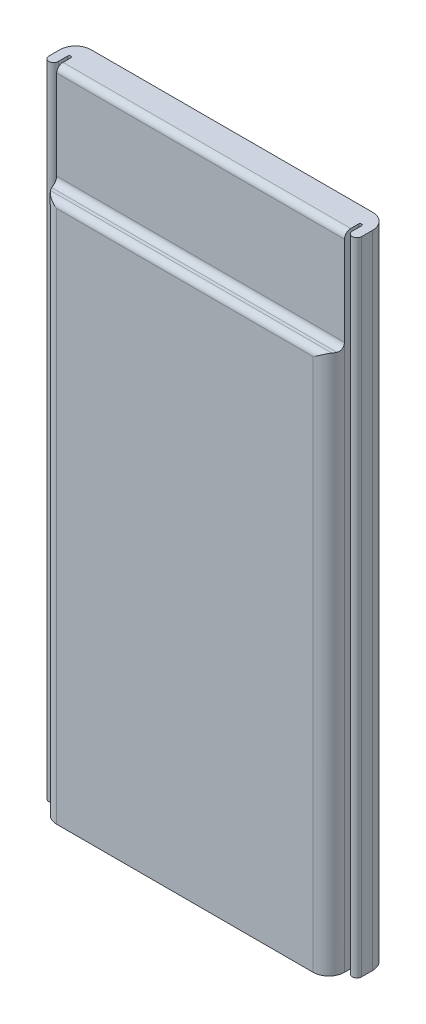
ISO-10303-21;
HEADER;
FILE_DESCRIPTION(('STEP AP214'),'2;1');
FILE_NAME('part.step','',(''),(''),'','','');
FILE_SCHEMA(('AUTOMOTIVE_DESIGN { 1 0 10303 214 1 1 1 1 }'));
ENDSEC;
DATA;
#1=APPLICATION_CONTEXT('core data for automotive mechanical design processes');
#2=APPLICATION_PROTOCOL_DEFINITION('international standard','automotive_design',2000,#1);
#3=PRODUCT_CONTEXT('',#1,'mechanical');
#4=PRODUCT('Part','Part','',(#3));
#5=PRODUCT_RELATED_PRODUCT_CATEGORY('part','',(#4));
#6=PRODUCT_DEFINITION_FORMATION('','',#4);
#7=PRODUCT_DEFINITION_CONTEXT('part definition',#1,'design');
#8=PRODUCT_DEFINITION('design','',#6,#7);
#9=PRODUCT_DEFINITION_SHAPE('','',#8);
#10=(LENGTH_UNIT() NAMED_UNIT(*) SI_UNIT(.MILLI.,.METRE.));
#11=(NAMED_UNIT(*) PLANE_ANGLE_UNIT() SI_UNIT($,.RADIAN.));
#12=(NAMED_UNIT(*) SI_UNIT($,.STERADIAN.) SOLID_ANGLE_UNIT());
#13=UNCERTAINTY_MEASURE_WITH_UNIT(LENGTH_MEASURE(1.E-05),#10,'distance_accuracy_value','');
#14=(GEOMETRIC_REPRESENTATION_CONTEXT(3) GLOBAL_UNCERTAINTY_ASSIGNED_CONTEXT((#13)) GLOBAL_UNIT_ASSIGNED_CONTEXT((#10,
#11,#12)) REPRESENTATION_CONTEXT('',''));
#15=CARTESIAN_POINT('',(0.,0.,0.));
#16=DIRECTION('',(0.,0.,1.));
#17=DIRECTION('',(1.,0.,0.));
#18=AXIS2_PLACEMENT_3D('',#15,#16,#17);
#19=CARTESIAN_POINT('',(-9.2,20.5,2.));
#20=DIRECTION('',(1.,0.,0.));
#21=DIRECTION('',(0.,0.,-1.));
#22=AXIS2_PLACEMENT_3D('',#19,#20,#21);
#23=PLANE('',#22);
#24=CARTESIAN_POINT('',(-9.2,20.1,1.6));
#25=DIRECTION('',(1.,0.,0.));
#26=DIRECTION('',(0.,0.,-1.));
#27=AXIS2_PLACEMENT_3D('',#24,#25,#26);
#28=CIRCLE('',#27,0.400000000000001);
#29=CARTESIAN_POINT('',(-9.2,20.5,1.6));
#30=VERTEX_POINT('',#29);
#31=CARTESIAN_POINT('',(-9.2,20.1,2.));
#32=VERTEX_POINT('',#31);
#33=EDGE_CURVE('E452',#30,#32,#28,.T.);
#34=ORIENTED_EDGE('',*,*,#33,.F.);
#35=DIRECTION('',(0.,0.,1.));
#36=VECTOR('',#35,1.);
#37=CARTESIAN_POINT('',(-9.2,20.5,2.));
#38=LINE('',#37,#36);
#39=CARTESIAN_POINT('',(-9.2,20.5,1.1));
#40=VERTEX_POINT('',#39);
#41=EDGE_CURVE('E268',#40,#30,#38,.T.);
#42=ORIENTED_EDGE('',*,*,#41,.F.);
#43=DIRECTION('',(0.,-1.,0.));
#44=VECTOR('',#43,1.);
#45=CARTESIAN_POINT('',(-9.2,20.5,1.1));
#46=LINE('',#45,#44);
#47=CARTESIAN_POINT('',(-9.2,-20.5,1.1));
#48=VERTEX_POINT('',#47);
#49=EDGE_CURVE('E236',#40,#48,#46,.T.);
#50=ORIENTED_EDGE('',*,*,#49,.T.);
#51=DIRECTION('',(0.,0.,1.));
#52=VECTOR('',#51,1.);
#53=CARTESIAN_POINT('',(-9.2,-20.5,2.));
#54=LINE('',#53,#52);
#55=CARTESIAN_POINT('',(-9.2,-20.5,2.));
#56=VERTEX_POINT('',#55);
#57=EDGE_CURVE('E191',#48,#56,#54,.T.);
#58=ORIENTED_EDGE('',*,*,#57,.T.);
#59=DIRECTION('',(0.,-1.,0.));
#60=VECTOR('',#59,1.);
#61=CARTESIAN_POINT('',(-9.2,20.5,2.));
#62=LINE('',#61,#60);
#63=CARTESIAN_POINT('',(-9.2,14.4,2.));
#64=VERTEX_POINT('',#63);
#65=EDGE_CURVE('E234',#64,#56,#62,.T.);
#66=ORIENTED_EDGE('',*,*,#65,.F.);
#67=DIRECTION('',(0.,-1.,0.));
#68=VECTOR('',#67,1.);
#69=CARTESIAN_POINT('',(-9.2,20.5,2.));
#70=LINE('',#69,#68);
#71=EDGE_CURVE('E435',#32,#64,#70,.T.);
#72=ORIENTED_EDGE('',*,*,#71,.F.);
#73=EDGE_LOOP('',(#34,#42,#50,#58,#66,#72));
#74=FACE_BOUND('',#73,.T.);
#75=ADVANCED_FACE('F35',(#74),#23,.F.);
#76=CARTESIAN_POINT('',(-8.2,20.5,2.));
#77=DIRECTION('',(0.,-1.,0.));
#78=DIRECTION('',(0.,0.,-1.));
#79=AXIS2_PLACEMENT_3D('',#76,#77,#78);
#80=CYLINDRICAL_SURFACE('',#79,1.);
#81=CARTESIAN_POINT('',(-9.2,14.4,2.));
#82=CARTESIAN_POINT('',(-9.19997847905916,14.3775325233535,1.99998093151565));
#83=CARTESIAN_POINT('',(-9.19999963365322,14.355070373881,2.00189182556233));
#84=CARTESIAN_POINT('',(-9.19996829370539,14.3107904412264,2.00943417123763));
#85=CARTESIAN_POINT('',(-9.19991583583453,14.2889723427291,2.01506376960551));
#86=CARTESIAN_POINT('',(-9.19957847014619,14.2465785727421,2.0299086262157));
#87=CARTESIAN_POINT('',(-9.19929343033504,14.2260036138756,2.03912591897356));
#88=CARTESIAN_POINT('',(-9.19820511756865,14.1867020384617,2.0608718750226));
#89=CARTESIAN_POINT('',(-9.19740192790328,14.1679751254084,2.07340000592295));
#90=CARTESIAN_POINT('',(-9.19495392794561,14.1330328543871,2.10129448001161));
#91=CARTESIAN_POINT('',(-9.19331472254887,14.1168016954871,2.11664149165532));
#92=CARTESIAN_POINT('',(-9.18886878410621,14.0871864353159,2.14972019250299));
#93=CARTESIAN_POINT('',(-9.18606257639943,14.073801057077,2.16745080627446));
#94=CARTESIAN_POINT('',(-9.17910873460781,14.0505573373619,2.20416996949274));
#95=CARTESIAN_POINT('',(-9.17499911965366,14.0406139847208,2.22311199240439));
#96=CARTESIAN_POINT('',(-9.16527183490216,14.0239573871511,2.26201544015336));
#97=CARTESIAN_POINT('',(-9.15965346180776,14.0172456527044,2.28197733687485));
#98=CARTESIAN_POINT('',(-9.14810241763259,14.008044007862,2.31842546140316));
#99=CARTESIAN_POINT('',(-9.14242865197299,14.0049967480144,2.33485751705032));
#100=CARTESIAN_POINT('',(-9.13015337511731,14.0009729837141,2.36759286116685));
#101=CARTESIAN_POINT('',(-9.12355371623052,13.9999924059977,2.38389633971359));
#102=CARTESIAN_POINT('',(-9.11651513899117,14.,2.4));
#103=B_SPLINE_CURVE_WITH_KNOTS('',3,(#81,#82,#83,#84,#85,#86,#87,#88,#89,#90,#91,#92,#93,#94,
#95,#96,#97,#98,#99,#100,#101,#102),.UNSPECIFIED.,.F.,.F.,(4,2,2,2,2,2,2,2,2,2,4),(0.,
0.0673138199880914,0.134594118613188,0.20191262637601,0.269220315738878,0.336082572906073,
0.402914763806312,0.467953461113566,0.533022528539233,0.585825359497231,0.638524022644764),.UNSPECIFIED.);
#104=CARTESIAN_POINT('',(-9.11651513899117,14.,2.4));
#105=VERTEX_POINT('',#104);
#106=EDGE_CURVE('E432',#64,#105,#103,.T.);
#107=ORIENTED_EDGE('',*,*,#106,.F.);
#108=ORIENTED_EDGE('',*,*,#65,.T.);
#109=CARTESIAN_POINT('',(-8.2,-20.5,2.));
#110=DIRECTION('',(0.,1.,0.));
#111=DIRECTION('',(0.,0.,1.));
#112=AXIS2_PLACEMENT_3D('',#109,#110,#111);
#113=CIRCLE('',#112,1.);
#114=CARTESIAN_POINT('',(-8.2,-20.5,3.));
#115=VERTEX_POINT('',#114);
#116=EDGE_CURVE('E194',#56,#115,#113,.T.);
#117=ORIENTED_EDGE('',*,*,#116,.T.);
#118=DIRECTION('',(0.,-1.,0.));
#119=VECTOR('',#118,1.);
#120=CARTESIAN_POINT('',(-8.2,20.5,3.));
#121=LINE('',#120,#119);
#122=CARTESIAN_POINT('',(-8.2,13.6,3.));
#123=VERTEX_POINT('',#122);
#124=EDGE_CURVE('E232',#123,#115,#121,.T.);
#125=ORIENTED_EDGE('',*,*,#124,.F.);
#126=CARTESIAN_POINT('',(-9.,14.,2.6));
#127=CARTESIAN_POINT('',(-8.97946555578519,13.999963502659,2.62742158688643));
#128=CARTESIAN_POINT('',(-8.95759830631048,13.997191577115,2.65360470949975));
#129=CARTESIAN_POINT('',(-8.91200033520254,13.9873375955562,2.70296457420721));
#130=CARTESIAN_POINT('',(-8.88828992837434,13.9802979548521,2.72616821267421));
#131=CARTESIAN_POINT('',(-8.82900594180071,13.9593597466306,2.77879996658453));
#132=CARTESIAN_POINT('',(-8.79266811241833,13.9438182116336,2.8066906262616));
#133=CARTESIAN_POINT('',(-8.71791017121064,13.9083623370661,2.85662413275788));
#134=CARTESIAN_POINT('',(-8.67947861979781,13.8884216722672,2.87862993057854));
#135=CARTESIAN_POINT('',(-8.58519541916725,13.8368522731022,2.92488471521433));
#136=CARTESIAN_POINT('',(-8.52872579474076,13.8038047508952,2.9462829915298));
#137=CARTESIAN_POINT('',(-8.41473104531994,13.7349288005912,2.97846495796601));
#138=CARTESIAN_POINT('',(-8.35720804687593,13.6991055857256,2.98926805013529));
#139=CARTESIAN_POINT('',(-8.26816052657994,13.6431017838822,2.99817080641197));
#140=CARTESIAN_POINT('',(-8.23675096803174,13.6232429928818,2.99981786747483));
#141=CARTESIAN_POINT('',(-8.20356347320437,13.602253739636,2.99999523668233));
#142=CARTESIAN_POINT('',(-8.20178172569564,13.6011268636092,2.99999999807848));
#143=CARTESIAN_POINT('',(-8.2,13.6,3.));
#144=B_SPLINE_CURVE_WITH_KNOTS('',3,(#126,#127,#128,#129,#130,#131,#132,#133,#134,#135,#136,
#137,#138,#139,#140,#141,#142,#143),.UNSPECIFIED.,.F.,.F.,(4,2,2,2,2,2,2,2,4),(0.,
0.102339866834824,0.203678917670562,0.348024697625978,0.493258904873183,0.698689883440704,
0.903743967608913,1.01522241349045,1.02154698494518),.UNSPECIFIED.);
#145=CARTESIAN_POINT('',(-9.,14.,2.6));
#146=VERTEX_POINT('',#145);
#147=EDGE_CURVE('E433',#146,#123,#144,.T.);
#148=ORIENTED_EDGE('',*,*,#147,.F.);
#149=CARTESIAN_POINT('',(-8.2,14.,2.));
#150=DIRECTION('',(0.,-1.,0.));
#151=DIRECTION('',(0.,0.,-1.));
#152=AXIS2_PLACEMENT_3D('',#149,#150,#151);
#153=CIRCLE('',#152,1.);
#154=EDGE_CURVE('E426',#105,#146,#153,.F.);
#155=ORIENTED_EDGE('',*,*,#154,.F.);
#156=EDGE_LOOP('',(#107,#108,#117,#125,#148,#155));
#157=FACE_BOUND('',#156,.T.);
#158=ADVANCED_FACE('F360',(#157),#80,.T.);
#159=CARTESIAN_POINT('',(8.2,20.5,2.));
#160=DIRECTION('',(0.,-1.,0.));
#161=DIRECTION('',(0.,0.,-1.));
#162=AXIS2_PLACEMENT_3D('',#159,#160,#161);
#163=CYLINDRICAL_SURFACE('',#162,1.);
#164=CARTESIAN_POINT('',(9.2,14.4,2.));
#165=CARTESIAN_POINT('',(9.19997847905916,14.3775325233535,1.99998093151565));
#166=CARTESIAN_POINT('',(9.19999963365321,14.355070373881,2.00189182556233));
#167=CARTESIAN_POINT('',(9.19996829370539,14.3107904412264,2.00943417123763));
#168=CARTESIAN_POINT('',(9.19991583583453,14.2889723427291,2.01506376960551));
#169=CARTESIAN_POINT('',(9.19957847014619,14.2465785727421,2.0299086262157));
#170=CARTESIAN_POINT('',(9.19929343033503,14.2260036138756,2.03912591897356));
#171=CARTESIAN_POINT('',(9.19820511756865,14.1867020384617,2.0608718750226));
#172=CARTESIAN_POINT('',(9.19740192790328,14.1679751254084,2.07340000592295));
#173=CARTESIAN_POINT('',(9.19495392794561,14.1330328543871,2.10129448001161));
#174=CARTESIAN_POINT('',(9.19331472254886,14.1168016954871,2.11664149165532));
#175=CARTESIAN_POINT('',(9.18886878410621,14.0871864353159,2.14972019250299));
#176=CARTESIAN_POINT('',(9.18606257639943,14.073801057077,2.16745080627446));
#177=CARTESIAN_POINT('',(9.17910873460781,14.0505573373619,2.20416996949274));
#178=CARTESIAN_POINT('',(9.17499911965366,14.0406139847208,2.22311199240439));
#179=CARTESIAN_POINT('',(9.16527183490216,14.0239573871511,2.26201544015336));
#180=CARTESIAN_POINT('',(9.15965346180775,14.0172456527044,2.28197733687485));
#181=CARTESIAN_POINT('',(9.14810241763258,14.008044007862,2.31842546140316));
#182=CARTESIAN_POINT('',(9.14242865197299,14.0049967480144,2.33485751705032));
#183=CARTESIAN_POINT('',(9.1301533751173,14.0009729837141,2.36759286116685));
#184=CARTESIAN_POINT('',(9.12355371623052,13.9999924059977,2.38389633971359));
#185=CARTESIAN_POINT('',(9.11651513899116,14.,2.4));
#186=B_SPLINE_CURVE_WITH_KNOTS('',3,(#164,#165,#166,#167,#168,#169,#170,#171,#172,#173,#174,
#175,#176,#177,#178,#179,#180,#181,#182,#183,#184,#185),.UNSPECIFIED.,.F.,.F.,(4,2,2,2,2,2,2,2,
2,2,4),(0.,0.0673138199880914,0.134594118613188,0.20191262637601,0.269220315738878,
0.336082572906073,0.402914763806312,0.467953461113566,0.533022528539233,0.585825359497231,
0.638524022644764),.UNSPECIFIED.);
#187=CARTESIAN_POINT('',(9.2,14.4,2.));
#188=VERTEX_POINT('',#187);
#189=CARTESIAN_POINT('',(9.11651513899116,14.,2.4));
#190=VERTEX_POINT('',#189);
#191=EDGE_CURVE('E339',#188,#190,#186,.T.);
#192=ORIENTED_EDGE('',*,*,#191,.T.);
#193=CARTESIAN_POINT('',(8.2,14.,2.));
#194=DIRECTION('',(0.,1.,0.));
#195=DIRECTION('',(0.,0.,1.));
#196=AXIS2_PLACEMENT_3D('',#193,#194,#195);
#197=CIRCLE('',#196,1.);
#198=CARTESIAN_POINT('',(9.,14.,2.6));
#199=VERTEX_POINT('',#198);
#200=EDGE_CURVE('E325',#190,#199,#197,.F.);
#201=ORIENTED_EDGE('',*,*,#200,.T.);
#202=CARTESIAN_POINT('',(9.,14.,2.6));
#203=CARTESIAN_POINT('',(8.97946555578518,13.999963502659,2.62742158688644));
#204=CARTESIAN_POINT('',(8.95759830631047,13.997191577115,2.65360470949976));
#205=CARTESIAN_POINT('',(8.91200033520253,13.9873375955562,2.70296457420722));
#206=CARTESIAN_POINT('',(8.88828992837433,13.9802979548521,2.72616821267421));
#207=CARTESIAN_POINT('',(8.82900594180071,13.9593597466306,2.77879996658453));
#208=CARTESIAN_POINT('',(8.79266811241834,13.9438182116336,2.80669062626159));
#209=CARTESIAN_POINT('',(8.71791017121065,13.9083623370662,2.85662413275788));
#210=CARTESIAN_POINT('',(8.67947861979779,13.8884216722672,2.87862993057853));
#211=CARTESIAN_POINT('',(8.58519541916726,13.8368522731021,2.92488471521433));
#212=CARTESIAN_POINT('',(8.52872579474085,13.803804750895,2.94628299152981));
#213=CARTESIAN_POINT('',(8.41473104531983,13.7349288005913,2.97846495796601));
#214=CARTESIAN_POINT('',(8.35720804687554,13.6991055857262,2.98926805013529));
#215=CARTESIAN_POINT('',(8.26816052658016,13.6431017838819,2.99817080641198));
#216=CARTESIAN_POINT('',(8.23675096803236,13.6232429928809,2.99981786747484));
#217=CARTESIAN_POINT('',(8.20356347320443,13.6022537396359,2.99999523668233));
#218=CARTESIAN_POINT('',(8.20178172569567,13.6011268636091,2.99999999807849));
#219=CARTESIAN_POINT('',(8.2,13.6,3.));
#220=B_SPLINE_CURVE_WITH_KNOTS('',3,(#202,#203,#204,#205,#206,#207,#208,#209,#210,#211,#212,
#213,#214,#215,#216,#217,#218,#219),.UNSPECIFIED.,.F.,.F.,(4,2,2,2,2,2,2,2,4),(0.,
0.102339866834843,0.203678917670562,0.348024697625964,0.493258904873183,0.698689883440717,
0.90374396760891,1.01522241349045,1.02154698494518),.UNSPECIFIED.);
#221=CARTESIAN_POINT('',(8.2,13.6,3.));
#222=VERTEX_POINT('',#221);
#223=EDGE_CURVE('E316',#199,#222,#220,.T.);
#224=ORIENTED_EDGE('',*,*,#223,.T.);
#225=DIRECTION('',(0.,-1.,0.));
#226=VECTOR('',#225,1.);
#227=CARTESIAN_POINT('',(8.2,20.5,3.));
#228=LINE('',#227,#226);
#229=CARTESIAN_POINT('',(8.2,-20.5,3.));
#230=VERTEX_POINT('',#229);
#231=EDGE_CURVE('E230',#222,#230,#228,.T.);
#232=ORIENTED_EDGE('',*,*,#231,.T.);
#233=CARTESIAN_POINT('',(8.2,-20.5,2.));
#234=DIRECTION('',(0.,1.,0.));
#235=DIRECTION('',(0.,0.,-1.));
#236=AXIS2_PLACEMENT_3D('',#233,#234,#235);
#237=CIRCLE('',#236,1.);
#238=CARTESIAN_POINT('',(9.2,-20.5,2.));
#239=VERTEX_POINT('',#238);
#240=EDGE_CURVE('E200',#230,#239,#237,.T.);
#241=ORIENTED_EDGE('',*,*,#240,.T.);
#242=DIRECTION('',(0.,-1.,0.));
#243=VECTOR('',#242,1.);
#244=CARTESIAN_POINT('',(9.2,20.5,2.));
#245=LINE('',#244,#243);
#246=EDGE_CURVE('E228',#188,#239,#245,.T.);
#247=ORIENTED_EDGE('',*,*,#246,.F.);
#248=EDGE_LOOP('',(#192,#201,#224,#232,#241,#247));
#249=FACE_BOUND('',#248,.T.);
#250=ADVANCED_FACE('F366',(#249),#163,.T.);
#251=CARTESIAN_POINT('',(9.2,20.5,1.1));
#252=DIRECTION('',(-1.,0.,0.));
#253=DIRECTION('',(0.,0.,1.));
#254=AXIS2_PLACEMENT_3D('',#251,#252,#253);
#255=PLANE('',#254);
#256=CARTESIAN_POINT('',(9.2,20.1,1.6));
#257=DIRECTION('',(-1.,0.,0.));
#258=DIRECTION('',(0.,0.,1.));
#259=AXIS2_PLACEMENT_3D('',#256,#257,#258);
#260=CIRCLE('',#259,0.400000000000001);
#261=CARTESIAN_POINT('',(9.2,20.5,1.6));
#262=VERTEX_POINT('',#261);
#263=CARTESIAN_POINT('',(9.2,20.1,2.));
#264=VERTEX_POINT('',#263);
#265=EDGE_CURVE('E50',#262,#264,#260,.F.);
#266=ORIENTED_EDGE('',*,*,#265,.T.);
#267=DIRECTION('',(0.,-1.,0.));
#268=VECTOR('',#267,1.);
#269=CARTESIAN_POINT('',(9.2,20.1,2.));
#270=LINE('',#269,#268);
#271=EDGE_CURVE('E183',#264,#188,#270,.T.);
#272=ORIENTED_EDGE('',*,*,#271,.T.);
#273=ORIENTED_EDGE('',*,*,#246,.T.);
#274=DIRECTION('',(0.,0.,-1.));
#275=VECTOR('',#274,1.);
#276=CARTESIAN_POINT('',(9.2,-20.5,1.1));
#277=LINE('',#276,#275);
#278=CARTESIAN_POINT('',(9.2,-20.5,1.1));
#279=VERTEX_POINT('',#278);
#280=EDGE_CURVE('E203',#239,#279,#277,.T.);
#281=ORIENTED_EDGE('',*,*,#280,.T.);
#282=DIRECTION('',(0.,-1.,0.));
#283=VECTOR('',#282,1.);
#284=CARTESIAN_POINT('',(9.2,20.5,1.1));
#285=LINE('',#284,#283);
#286=CARTESIAN_POINT('',(9.2,20.5,1.1));
#287=VERTEX_POINT('',#286);
#288=EDGE_CURVE('E225',#287,#279,#285,.T.);
#289=ORIENTED_EDGE('',*,*,#288,.F.);
#290=DIRECTION('',(0.,0.,-1.));
#291=VECTOR('',#290,1.);
#292=CARTESIAN_POINT('',(9.2,20.5,1.1));
#293=LINE('',#292,#291);
#294=EDGE_CURVE('E271',#262,#287,#293,.T.);
#295=ORIENTED_EDGE('',*,*,#294,.F.);
#296=EDGE_LOOP('',(#266,#272,#273,#281,#289,#295));
#297=FACE_BOUND('',#296,.T.);
#298=ADVANCED_FACE('F383',(#297),#255,.F.);
#299=CARTESIAN_POINT('',(-9.,20.5,0.999999999999998));
#300=DIRECTION('',(0.,-1.,0.));
#301=DIRECTION('',(0.,0.,-1.));
#302=AXIS2_PLACEMENT_3D('',#299,#300,#301);
#303=CYLINDRICAL_SURFACE('',#302,0.999999999999999);
#304=CARTESIAN_POINT('',(-9.,-20.5,0.999999999999998));
#305=DIRECTION('',(0.,1.,0.));
#306=DIRECTION('',(0.,0.,1.));
#307=AXIS2_PLACEMENT_3D('',#304,#305,#306);
#308=CIRCLE('',#307,0.999999999999999);
#309=CARTESIAN_POINT('',(-9.,-20.5,0.));
#310=VERTEX_POINT('',#309);
#311=CARTESIAN_POINT('',(-10.,-20.5,1.));
#312=VERTEX_POINT('',#311);
#313=EDGE_CURVE('E179',#310,#312,#308,.T.);
#314=ORIENTED_EDGE('',*,*,#313,.T.);
#315=DIRECTION('',(0.,-1.,0.));
#316=VECTOR('',#315,1.);
#317=CARTESIAN_POINT('',(-10.,20.5,1.));
#318=LINE('',#317,#316);
#319=CARTESIAN_POINT('',(-10.,20.5,1.));
#320=VERTEX_POINT('',#319);
#321=EDGE_CURVE('E11',#320,#312,#318,.T.);
#322=ORIENTED_EDGE('',*,*,#321,.F.);
#323=CARTESIAN_POINT('',(-9.,20.5,0.999999999999998));
#324=DIRECTION('',(0.,1.,0.));
#325=DIRECTION('',(0.,0.,1.));
#326=AXIS2_PLACEMENT_3D('',#323,#324,#325);
#327=CIRCLE('',#326,0.999999999999999);
#328=CARTESIAN_POINT('',(-9.,20.5,0.));
#329=VERTEX_POINT('',#328);
#330=EDGE_CURVE('E215',#329,#320,#327,.T.);
#331=ORIENTED_EDGE('',*,*,#330,.F.);
#332=DIRECTION('',(0.,-1.,0.));
#333=VECTOR('',#332,1.);
#334=CARTESIAN_POINT('',(-9.,20.5,0.));
#335=LINE('',#334,#333);
#336=EDGE_CURVE('E175',#329,#310,#335,.T.);
#337=ORIENTED_EDGE('',*,*,#336,.T.);
#338=EDGE_LOOP('',(#314,#322,#331,#337));
#339=FACE_BOUND('',#338,.T.);
#340=ADVANCED_FACE('F37',(#339),#303,.T.);
#341=CARTESIAN_POINT('',(-10.,20.5,1.));
#342=DIRECTION('',(1.,0.,0.));
#343=DIRECTION('',(0.,0.,-1.));
#344=AXIS2_PLACEMENT_3D('',#341,#342,#343);
#345=PLANE('',#344);
#346=DIRECTION('',(0.,0.,1.));
#347=VECTOR('',#346,1.);
#348=CARTESIAN_POINT('',(-10.,-20.5,1.));
#349=LINE('',#348,#347);
#350=CARTESIAN_POINT('',(-10.,-20.5,1.7));
#351=VERTEX_POINT('',#350);
#352=EDGE_CURVE('E182',#312,#351,#349,.T.);
#353=ORIENTED_EDGE('',*,*,#352,.T.);
#354=DIRECTION('',(0.,-1.,0.));
#355=VECTOR('',#354,1.);
#356=CARTESIAN_POINT('',(-10.,20.5,1.7));
#357=LINE('',#356,#355);
#358=CARTESIAN_POINT('',(-10.,20.5,1.7));
#359=VERTEX_POINT('',#358);
#360=EDGE_CURVE('E43',#359,#351,#357,.T.);
#361=ORIENTED_EDGE('',*,*,#360,.F.);
#362=DIRECTION('',(0.,0.,1.));
#363=VECTOR('',#362,1.);
#364=CARTESIAN_POINT('',(-10.,20.5,1.));
#365=LINE('',#364,#363);
#366=EDGE_CURVE('E124',#320,#359,#365,.T.);
#367=ORIENTED_EDGE('',*,*,#366,.F.);
#368=ORIENTED_EDGE('',*,*,#321,.T.);
#369=EDGE_LOOP('',(#353,#361,#367,#368));
#370=FACE_BOUND('',#369,.T.);
#371=ADVANCED_FACE('F378',(#370),#345,.F.);
#372=CARTESIAN_POINT('',(-9.7,20.5,1.7));
#373=DIRECTION('',(0.,-1.,0.));
#374=DIRECTION('',(0.,0.,-1.));
#375=AXIS2_PLACEMENT_3D('',#372,#373,#374);
#376=CYLINDRICAL_SURFACE('',#375,0.300000000000002);
#377=CARTESIAN_POINT('',(-9.7,-20.5,1.7));
#378=DIRECTION('',(0.,1.,0.));
#379=DIRECTION('',(0.,0.,1.));
#380=AXIS2_PLACEMENT_3D('',#377,#378,#379);
#381=CIRCLE('',#380,0.300000000000002);
#382=CARTESIAN_POINT('',(-9.4,-20.5,1.7));
#383=VERTEX_POINT('',#382);
#384=EDGE_CURVE('E185',#351,#383,#381,.T.);
#385=ORIENTED_EDGE('',*,*,#384,.T.);
#386=DIRECTION('',(0.,-1.,0.));
#387=VECTOR('',#386,1.);
#388=CARTESIAN_POINT('',(-9.4,20.5,1.7));
#389=LINE('',#388,#387);
#390=CARTESIAN_POINT('',(-9.4,20.5,1.7));
#391=VERTEX_POINT('',#390);
#392=EDGE_CURVE('E242',#391,#383,#389,.T.);
#393=ORIENTED_EDGE('',*,*,#392,.F.);
#394=CARTESIAN_POINT('',(-9.7,20.5,1.7));
#395=DIRECTION('',(0.,1.,0.));
#396=DIRECTION('',(0.,0.,1.));
#397=AXIS2_PLACEMENT_3D('',#394,#395,#396);
#398=CIRCLE('',#397,0.300000000000002);
#399=EDGE_CURVE('E250',#359,#391,#398,.T.);
#400=ORIENTED_EDGE('',*,*,#399,.F.);
#401=ORIENTED_EDGE('',*,*,#360,.T.);
#402=EDGE_LOOP('',(#385,#393,#400,#401));
#403=FACE_BOUND('',#402,.T.);
#404=ADVANCED_FACE('F248',(#403),#376,.T.);
#405=CARTESIAN_POINT('',(-9.4,20.5,1.7));
#406=DIRECTION('',(-1.,0.,0.));
#407=DIRECTION('',(0.,0.,1.));
#408=AXIS2_PLACEMENT_3D('',#405,#406,#407);
#409=PLANE('',#408);
#410=DIRECTION('',(0.,0.,-1.));
#411=VECTOR('',#410,1.);
#412=CARTESIAN_POINT('',(-9.4,-20.5,1.7));
#413=LINE('',#412,#411);
#414=CARTESIAN_POINT('',(-9.4,-20.5,1.1));
#415=VERTEX_POINT('',#414);
#416=EDGE_CURVE('E187',#383,#415,#413,.T.);
#417=ORIENTED_EDGE('',*,*,#416,.T.);
#418=DIRECTION('',(0.,-1.,0.));
#419=VECTOR('',#418,1.);
#420=CARTESIAN_POINT('',(-9.4,20.5,1.1));
#421=LINE('',#420,#419);
#422=CARTESIAN_POINT('',(-9.4,20.5,1.1));
#423=VERTEX_POINT('',#422);
#424=EDGE_CURVE('E239',#423,#415,#421,.T.);
#425=ORIENTED_EDGE('',*,*,#424,.F.);
#426=DIRECTION('',(0.,0.,-1.));
#427=VECTOR('',#426,1.);
#428=CARTESIAN_POINT('',(-9.4,20.5,1.7));
#429=LINE('',#428,#427);
#430=EDGE_CURVE('E269',#391,#423,#429,.T.);
#431=ORIENTED_EDGE('',*,*,#430,.F.);
#432=ORIENTED_EDGE('',*,*,#392,.T.);
#433=EDGE_LOOP('',(#417,#425,#431,#432));
#434=FACE_BOUND('',#433,.T.);
#435=ADVANCED_FACE('F259',(#434),#409,.F.);
#436=CARTESIAN_POINT('',(-9.3,20.5,1.1));
#437=DIRECTION('',(0.,-1.,0.));
#438=DIRECTION('',(0.,0.,-1.));
#439=AXIS2_PLACEMENT_3D('',#436,#437,#438);
#440=CYLINDRICAL_SURFACE('',#439,0.0999999999999977);
#441=CARTESIAN_POINT('',(-9.3,-20.5,1.1));
#442=DIRECTION('',(0.,-1.,0.));
#443=DIRECTION('',(0.,0.,1.));
#444=AXIS2_PLACEMENT_3D('',#441,#442,#443);
#445=CIRCLE('',#444,0.0999999999999977);
#446=EDGE_CURVE('E189',#415,#48,#445,.T.);
#447=ORIENTED_EDGE('',*,*,#446,.T.);
#448=ORIENTED_EDGE('',*,*,#49,.F.);
#449=CARTESIAN_POINT('',(-9.3,20.5,1.1));
#450=DIRECTION('',(0.,-1.,0.));
#451=DIRECTION('',(0.,0.,1.));
#452=AXIS2_PLACEMENT_3D('',#449,#450,#451);
#453=CIRCLE('',#452,0.0999999999999977);
#454=EDGE_CURVE('E265',#423,#40,#453,.T.);
#455=ORIENTED_EDGE('',*,*,#454,.F.);
#456=ORIENTED_EDGE('',*,*,#424,.T.);
#457=EDGE_LOOP('',(#447,#448,#455,#456));
#458=FACE_BOUND('',#457,.T.);
#459=ADVANCED_FACE('F263',(#458),#440,.F.);
#460=CARTESIAN_POINT('',(-8.2,20.5,3.));
#461=DIRECTION('',(0.,0.,-1.));
#462=DIRECTION('',(-1.,0.,0.));
#463=AXIS2_PLACEMENT_3D('',#460,#461,#462);
#464=PLANE('',#463);
#465=ORIENTED_EDGE('',*,*,#231,.F.);
#466=DIRECTION('',(-1.,0.,0.));
#467=VECTOR('',#466,1.);
#468=CARTESIAN_POINT('',(10.001,13.6,3.));
#469=LINE('',#468,#467);
#470=EDGE_CURVE('E301',#222,#123,#469,.T.);
#471=ORIENTED_EDGE('',*,*,#470,.T.);
#472=ORIENTED_EDGE('',*,*,#124,.T.);
#473=DIRECTION('',(1.,0.,0.));
#474=VECTOR('',#473,1.);
#475=CARTESIAN_POINT('',(-8.2,-20.5,3.));
#476=LINE('',#475,#474);
#477=EDGE_CURVE('E197',#115,#230,#476,.T.);
#478=ORIENTED_EDGE('',*,*,#477,.T.);
#479=EDGE_LOOP('',(#465,#471,#472,#478));
#480=FACE_BOUND('',#479,.T.);
#481=ADVANCED_FACE('F374',(#480),#464,.F.);
#482=CARTESIAN_POINT('',(9.3,20.5,1.1));
#483=DIRECTION('',(0.,-1.,0.));
#484=DIRECTION('',(0.,0.,-1.));
#485=AXIS2_PLACEMENT_3D('',#482,#483,#484);
#486=CYLINDRICAL_SURFACE('',#485,0.0999999999999977);
#487=CARTESIAN_POINT('',(9.3,-20.5,1.1));
#488=DIRECTION('',(0.,-1.,0.));
#489=DIRECTION('',(0.,0.,-1.));
#490=AXIS2_PLACEMENT_3D('',#487,#488,#489);
#491=CIRCLE('',#490,0.0999999999999977);
#492=CARTESIAN_POINT('',(9.39999999999999,-20.5,1.1));
#493=VERTEX_POINT('',#492);
#494=EDGE_CURVE('E205',#279,#493,#491,.T.);
#495=ORIENTED_EDGE('',*,*,#494,.T.);
#496=DIRECTION('',(0.,-1.,0.));
#497=VECTOR('',#496,1.);
#498=CARTESIAN_POINT('',(9.39999999999999,20.5,1.1));
#499=LINE('',#498,#497);
#500=CARTESIAN_POINT('',(9.39999999999999,20.5,1.1));
#501=VERTEX_POINT('',#500);
#502=EDGE_CURVE('E222',#501,#493,#499,.T.);
#503=ORIENTED_EDGE('',*,*,#502,.F.);
#504=CARTESIAN_POINT('',(9.3,20.5,1.1));
#505=DIRECTION('',(0.,-1.,0.));
#506=DIRECTION('',(0.,0.,-1.));
#507=AXIS2_PLACEMENT_3D('',#504,#505,#506);
#508=CIRCLE('',#507,0.0999999999999977);
#509=EDGE_CURVE('E277',#287,#501,#508,.T.);
#510=ORIENTED_EDGE('',*,*,#509,.F.);
#511=ORIENTED_EDGE('',*,*,#288,.T.);
#512=EDGE_LOOP('',(#495,#503,#510,#511));
#513=FACE_BOUND('',#512,.T.);
#514=ADVANCED_FACE('F395',(#513),#486,.F.);
#515=CARTESIAN_POINT('',(9.39999999999998,20.5,1.70000000000001));
#516=DIRECTION('',(1.,0.,0.));
#517=DIRECTION('',(0.,0.,-1.));
#518=AXIS2_PLACEMENT_3D('',#515,#516,#517);
#519=PLANE('',#518);
#520=DIRECTION('',(0.,0.,1.));
#521=VECTOR('',#520,1.);
#522=CARTESIAN_POINT('',(9.39999999999998,-20.5,1.70000000000001));
#523=LINE('',#522,#521);
#524=CARTESIAN_POINT('',(9.39999999999998,-20.5,1.70000000000001));
#525=VERTEX_POINT('',#524);
#526=EDGE_CURVE('E207',#493,#525,#523,.T.);
#527=ORIENTED_EDGE('',*,*,#526,.T.);
#528=DIRECTION('',(0.,-1.,0.));
#529=VECTOR('',#528,1.);
#530=CARTESIAN_POINT('',(9.39999999999998,20.5,1.70000000000001));
#531=LINE('',#530,#529);
#532=CARTESIAN_POINT('',(9.39999999999998,20.5,1.70000000000001));
#533=VERTEX_POINT('',#532);
#534=EDGE_CURVE('E219',#533,#525,#531,.T.);
#535=ORIENTED_EDGE('',*,*,#534,.F.);
#536=DIRECTION('',(0.,0.,1.));
#537=VECTOR('',#536,1.);
#538=CARTESIAN_POINT('',(9.39999999999998,20.5,1.70000000000001));
#539=LINE('',#538,#537);
#540=EDGE_CURVE('E279',#501,#533,#539,.T.);
#541=ORIENTED_EDGE('',*,*,#540,.F.);
#542=ORIENTED_EDGE('',*,*,#502,.T.);
#543=EDGE_LOOP('',(#527,#535,#541,#542));
#544=FACE_BOUND('',#543,.T.);
#545=ADVANCED_FACE('F285',(#544),#519,.F.);
#546=CARTESIAN_POINT('',(9.69999999999999,20.5,1.70000000000001));
#547=DIRECTION('',(0.,-1.,0.));
#548=DIRECTION('',(0.,0.,-1.));
#549=AXIS2_PLACEMENT_3D('',#546,#547,#548);
#550=CYLINDRICAL_SURFACE('',#549,0.300000000000009);
#551=CARTESIAN_POINT('',(9.69999999999999,-20.5,1.70000000000001));
#552=DIRECTION('',(0.,1.,0.));
#553=DIRECTION('',(0.,0.,-1.));
#554=AXIS2_PLACEMENT_3D('',#551,#552,#553);
#555=CIRCLE('',#554,0.300000000000009);
#556=CARTESIAN_POINT('',(10.,-20.5,1.70000000000001));
#557=VERTEX_POINT('',#556);
#558=EDGE_CURVE('E209',#525,#557,#555,.T.);
#559=ORIENTED_EDGE('',*,*,#558,.T.);
#560=DIRECTION('',(0.,-1.,0.));
#561=VECTOR('',#560,1.);
#562=CARTESIAN_POINT('',(10.,20.5,1.70000000000001));
#563=LINE('',#562,#561);
#564=CARTESIAN_POINT('',(10.,20.5,1.70000000000001));
#565=VERTEX_POINT('',#564);
#566=EDGE_CURVE('E170',#565,#557,#563,.T.);
#567=ORIENTED_EDGE('',*,*,#566,.F.);
#568=CARTESIAN_POINT('',(9.69999999999999,20.5,1.70000000000001));
#569=DIRECTION('',(0.,1.,0.));
#570=DIRECTION('',(0.,0.,-1.));
#571=AXIS2_PLACEMENT_3D('',#568,#569,#570);
#572=CIRCLE('',#571,0.300000000000009);
#573=EDGE_CURVE('E158',#533,#565,#572,.T.);
#574=ORIENTED_EDGE('',*,*,#573,.F.);
#575=ORIENTED_EDGE('',*,*,#534,.T.);
#576=EDGE_LOOP('',(#559,#567,#574,#575));
#577=FACE_BOUND('',#576,.T.);
#578=ADVANCED_FACE('F289',(#577),#550,.T.);
#579=CARTESIAN_POINT('',(10.,20.5,1.));
#580=DIRECTION('',(-1.,0.,0.));
#581=DIRECTION('',(0.,0.,1.));
#582=AXIS2_PLACEMENT_3D('',#579,#580,#581);
#583=PLANE('',#582);
#584=DIRECTION('',(0.,0.,-1.));
#585=VECTOR('',#584,1.);
#586=CARTESIAN_POINT('',(10.,-20.5,1.));
#587=LINE('',#586,#585);
#588=CARTESIAN_POINT('',(10.,-20.5,1.));
#589=VERTEX_POINT('',#588);
#590=EDGE_CURVE('E167',#557,#589,#587,.T.);
#591=ORIENTED_EDGE('',*,*,#590,.T.);
#592=DIRECTION('',(0.,-1.,0.));
#593=VECTOR('',#592,1.);
#594=CARTESIAN_POINT('',(10.,20.5,1.));
#595=LINE('',#594,#593);
#596=CARTESIAN_POINT('',(10.,20.5,1.));
#597=VERTEX_POINT('',#596);
#598=EDGE_CURVE('E164',#597,#589,#595,.T.);
#599=ORIENTED_EDGE('',*,*,#598,.F.);
#600=DIRECTION('',(0.,0.,-1.));
#601=VECTOR('',#600,1.);
#602=CARTESIAN_POINT('',(10.,20.5,1.));
#603=LINE('',#602,#601);
#604=EDGE_CURVE('E151',#565,#597,#603,.T.);
#605=ORIENTED_EDGE('',*,*,#604,.F.);
#606=ORIENTED_EDGE('',*,*,#566,.T.);
#607=EDGE_LOOP('',(#591,#599,#605,#606));
#608=FACE_BOUND('',#607,.T.);
#609=ADVANCED_FACE('F165',(#608),#583,.F.);
#610=CARTESIAN_POINT('',(9.,20.5,1.));
#611=DIRECTION('',(0.,-1.,0.));
#612=DIRECTION('',(0.,0.,-1.));
#613=AXIS2_PLACEMENT_3D('',#610,#611,#612);
#614=CYLINDRICAL_SURFACE('',#613,1.);
#615=CARTESIAN_POINT('',(9.,-20.5,1.));
#616=DIRECTION('',(0.,1.,0.));
#617=DIRECTION('',(0.,0.,-1.));
#618=AXIS2_PLACEMENT_3D('',#615,#616,#617);
#619=CIRCLE('',#618,1.);
#620=CARTESIAN_POINT('',(9.,-20.5,0.));
#621=VERTEX_POINT('',#620);
#622=EDGE_CURVE('E212',#589,#621,#619,.T.);
#623=ORIENTED_EDGE('',*,*,#622,.T.);
#624=DIRECTION('',(0.,-1.,0.));
#625=VECTOR('',#624,1.);
#626=CARTESIAN_POINT('',(9.,20.5,0.));
#627=LINE('',#626,#625);
#628=CARTESIAN_POINT('',(9.,20.5,0.));
#629=VERTEX_POINT('',#628);
#630=EDGE_CURVE('E171',#629,#621,#627,.T.);
#631=ORIENTED_EDGE('',*,*,#630,.F.);
#632=CARTESIAN_POINT('',(9.,20.5,1.));
#633=DIRECTION('',(0.,1.,0.));
#634=DIRECTION('',(0.,0.,-1.));
#635=AXIS2_PLACEMENT_3D('',#632,#633,#634);
#636=CIRCLE('',#635,1.);
#637=EDGE_CURVE('E155',#597,#629,#636,.T.);
#638=ORIENTED_EDGE('',*,*,#637,.F.);
#639=ORIENTED_EDGE('',*,*,#598,.T.);
#640=EDGE_LOOP('',(#623,#631,#638,#639));
#641=FACE_BOUND('',#640,.T.);
#642=ADVANCED_FACE('F173',(#641),#614,.T.);
#643=CARTESIAN_POINT('',(-9.,20.5,0.));
#644=DIRECTION('',(0.,0.,1.));
#645=DIRECTION('',(1.,0.,0.));
#646=AXIS2_PLACEMENT_3D('',#643,#644,#645);
#647=PLANE('',#646);
#648=DIRECTION('',(-1.,0.,0.));
#649=VECTOR('',#648,1.);
#650=CARTESIAN_POINT('',(-9.,-20.5,0.));
#651=LINE('',#650,#649);
#652=EDGE_CURVE('E116',#621,#310,#651,.T.);
#653=ORIENTED_EDGE('',*,*,#652,.T.);
#654=ORIENTED_EDGE('',*,*,#336,.F.);
#655=DIRECTION('',(-1.,0.,0.));
#656=VECTOR('',#655,1.);
#657=CARTESIAN_POINT('',(-9.,20.5,0.));
#658=LINE('',#657,#656);
#659=EDGE_CURVE('E59',#629,#329,#658,.T.);
#660=ORIENTED_EDGE('',*,*,#659,.F.);
#661=ORIENTED_EDGE('',*,*,#630,.T.);
#662=EDGE_LOOP('',(#653,#654,#660,#661));
#663=FACE_BOUND('',#662,.T.);
#664=ADVANCED_FACE('F290',(#663),#647,.F.);
#665=CARTESIAN_POINT('',(-9.,20.5,0.999999999999998));
#666=DIRECTION('',(0.,1.,0.));
#667=DIRECTION('',(0.,0.,1.));
#668=AXIS2_PLACEMENT_3D('',#665,#666,#667);
#669=PLANE('',#668);
#670=DIRECTION('',(-1.,0.,0.));
#671=VECTOR('',#670,1.);
#672=CARTESIAN_POINT('',(10.001,20.5,1.6));
#673=LINE('',#672,#671);
#674=EDGE_CURVE('E299',#262,#30,#673,.T.);
#675=ORIENTED_EDGE('',*,*,#674,.F.);
#676=ORIENTED_EDGE('',*,*,#294,.T.);
#677=ORIENTED_EDGE('',*,*,#509,.T.);
#678=ORIENTED_EDGE('',*,*,#540,.T.);
#679=ORIENTED_EDGE('',*,*,#573,.T.);
#680=ORIENTED_EDGE('',*,*,#604,.T.);
#681=ORIENTED_EDGE('',*,*,#637,.T.);
#682=ORIENTED_EDGE('',*,*,#659,.T.);
#683=ORIENTED_EDGE('',*,*,#330,.T.);
#684=ORIENTED_EDGE('',*,*,#366,.T.);
#685=ORIENTED_EDGE('',*,*,#399,.T.);
#686=ORIENTED_EDGE('',*,*,#430,.T.);
#687=ORIENTED_EDGE('',*,*,#454,.T.);
#688=ORIENTED_EDGE('',*,*,#41,.T.);
#689=EDGE_LOOP('',(#675,#676,#677,#678,#679,#680,#681,#682,#683,#684,#685,#686,#687,#688));
#690=FACE_BOUND('',#689,.T.);
#691=ADVANCED_FACE('F153',(#690),#669,.T.);
#692=CARTESIAN_POINT('',(-9.,-20.5,0.999999999999998));
#693=DIRECTION('',(0.,1.,0.));
#694=DIRECTION('',(0.,0.,1.));
#695=AXIS2_PLACEMENT_3D('',#692,#693,#694);
#696=PLANE('',#695);
#697=ORIENTED_EDGE('',*,*,#313,.F.);
#698=ORIENTED_EDGE('',*,*,#652,.F.);
#699=ORIENTED_EDGE('',*,*,#622,.F.);
#700=ORIENTED_EDGE('',*,*,#590,.F.);
#701=ORIENTED_EDGE('',*,*,#558,.F.);
#702=ORIENTED_EDGE('',*,*,#526,.F.);
#703=ORIENTED_EDGE('',*,*,#494,.F.);
#704=ORIENTED_EDGE('',*,*,#280,.F.);
#705=ORIENTED_EDGE('',*,*,#240,.F.);
#706=ORIENTED_EDGE('',*,*,#477,.F.);
#707=ORIENTED_EDGE('',*,*,#116,.F.);
#708=ORIENTED_EDGE('',*,*,#57,.F.);
#709=ORIENTED_EDGE('',*,*,#446,.F.);
#710=ORIENTED_EDGE('',*,*,#416,.F.);
#711=ORIENTED_EDGE('',*,*,#384,.F.);
#712=ORIENTED_EDGE('',*,*,#352,.F.);
#713=EDGE_LOOP('',(#697,#698,#699,#700,#701,#702,#703,#704,#705,#706,#707,#708,#709,#710,#711,#712));
#714=FACE_BOUND('',#713,.T.);
#715=ADVANCED_FACE('F254',(#714),#696,.F.);
#716=CARTESIAN_POINT('',(10.001,20.1,2.));
#717=DIRECTION('',(0.,0.,1.));
#718=DIRECTION('',(0.,-1.,0.));
#719=AXIS2_PLACEMENT_3D('',#716,#717,#718);
#720=PLANE('',#719);
#721=DIRECTION('',(-1.,0.,0.));
#722=VECTOR('',#721,1.);
#723=CARTESIAN_POINT('',(10.001,20.1,2.));
#724=LINE('',#723,#722);
#725=EDGE_CURVE('E313',#264,#32,#724,.T.);
#726=ORIENTED_EDGE('',*,*,#725,.T.);
#727=ORIENTED_EDGE('',*,*,#71,.T.);
#728=DIRECTION('',(-1.,0.,0.));
#729=VECTOR('',#728,1.);
#730=CARTESIAN_POINT('',(10.001,14.4,2.));
#731=LINE('',#730,#729);
#732=EDGE_CURVE('E310',#188,#64,#731,.T.);
#733=ORIENTED_EDGE('',*,*,#732,.F.);
#734=ORIENTED_EDGE('',*,*,#271,.F.);
#735=EDGE_LOOP('',(#726,#727,#733,#734));
#736=FACE_BOUND('',#735,.T.);
#737=ADVANCED_FACE('F336',(#736),#720,.T.);
#738=CARTESIAN_POINT('',(10.001,14.4,2.4));
#739=DIRECTION('',(-1.,0.,0.));
#740=DIRECTION('',(0.,0.,1.));
#741=AXIS2_PLACEMENT_3D('',#738,#739,#740);
#742=CYLINDRICAL_SURFACE('',#741,0.4);
#743=ORIENTED_EDGE('',*,*,#732,.T.);
#744=ORIENTED_EDGE('',*,*,#106,.T.);
#745=DIRECTION('',(-1.,0.,0.));
#746=VECTOR('',#745,1.);
#747=CARTESIAN_POINT('',(10.001,14.,2.4));
#748=LINE('',#747,#746);
#749=EDGE_CURVE('E307',#190,#105,#748,.T.);
#750=ORIENTED_EDGE('',*,*,#749,.F.);
#751=ORIENTED_EDGE('',*,*,#191,.F.);
#752=EDGE_LOOP('',(#743,#744,#750,#751));
#753=FACE_BOUND('',#752,.T.);
#754=ADVANCED_FACE('F347',(#753),#742,.F.);
#755=CARTESIAN_POINT('',(10.001,14.,2.4));
#756=DIRECTION('',(0.,1.,0.));
#757=DIRECTION('',(0.,0.,1.));
#758=AXIS2_PLACEMENT_3D('',#755,#756,#757);
#759=PLANE('',#758);
#760=ORIENTED_EDGE('',*,*,#749,.T.);
#761=ORIENTED_EDGE('',*,*,#154,.T.);
#762=DIRECTION('',(-1.,0.,0.));
#763=VECTOR('',#762,1.);
#764=CARTESIAN_POINT('',(10.001,14.,2.6));
#765=LINE('',#764,#763);
#766=EDGE_CURVE('E304',#199,#146,#765,.T.);
#767=ORIENTED_EDGE('',*,*,#766,.F.);
#768=ORIENTED_EDGE('',*,*,#200,.F.);
#769=EDGE_LOOP('',(#760,#761,#767,#768));
#770=FACE_BOUND('',#769,.T.);
#771=ADVANCED_FACE('F350',(#770),#759,.T.);
#772=CARTESIAN_POINT('',(10.001,13.6,2.6));
#773=DIRECTION('',(-1.,0.,0.));
#774=DIRECTION('',(0.,0.,1.));
#775=AXIS2_PLACEMENT_3D('',#772,#773,#774);
#776=CYLINDRICAL_SURFACE('',#775,0.399999999999999);
#777=ORIENTED_EDGE('',*,*,#766,.T.);
#778=ORIENTED_EDGE('',*,*,#147,.T.);
#779=ORIENTED_EDGE('',*,*,#470,.F.);
#780=ORIENTED_EDGE('',*,*,#223,.F.);
#781=EDGE_LOOP('',(#777,#778,#779,#780));
#782=FACE_BOUND('',#781,.T.);
#783=ADVANCED_FACE('F327',(#782),#776,.T.);
#784=CARTESIAN_POINT('',(10.001,20.1,1.6));
#785=DIRECTION('',(-1.,0.,0.));
#786=DIRECTION('',(0.,0.,1.));
#787=AXIS2_PLACEMENT_3D('',#784,#785,#786);
#788=CYLINDRICAL_SURFACE('',#787,0.400000000000001);
#789=ORIENTED_EDGE('',*,*,#674,.T.);
#790=ORIENTED_EDGE('',*,*,#33,.T.);
#791=ORIENTED_EDGE('',*,*,#725,.F.);
#792=ORIENTED_EDGE('',*,*,#265,.F.);
#793=EDGE_LOOP('',(#789,#790,#791,#792));
#794=FACE_BOUND('',#793,.T.);
#795=ADVANCED_FACE('F357',(#794),#788,.T.);
#796=CLOSED_SHELL('',(#75,#158,#250,#298,#340,#371,#404,#435,#459,#481,#514,#545,#578,#609,#642,
#664,#691,#715,#737,#754,#771,#783,#795));
#797=MANIFOLD_SOLID_BREP('B2',#796);
#798=ADVANCED_BREP_SHAPE_REPRESENTATION('',(#18,#797),#14);
#799=SHAPE_DEFINITION_REPRESENTATION(#9,#798);
ENDSEC;
END-ISO-10303-21;
